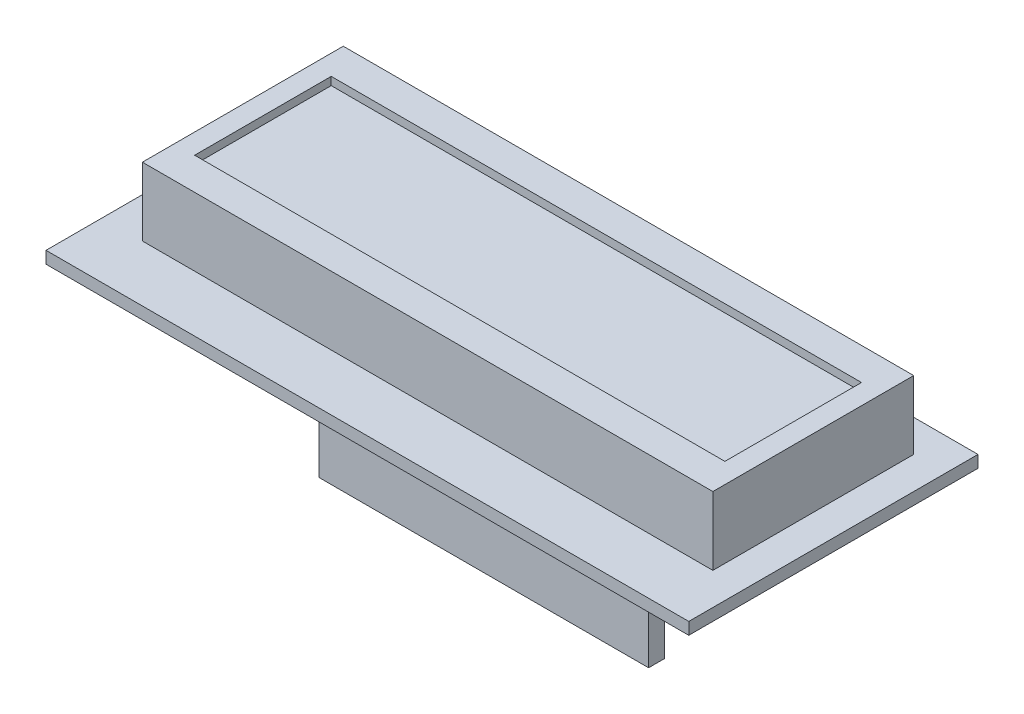
ISO-10303-21;
HEADER;
FILE_DESCRIPTION(('STEP AP214'),'2;1');
FILE_NAME('part.step','',(''),(''),'','','');
FILE_SCHEMA(('AUTOMOTIVE_DESIGN { 1 0 10303 214 1 1 1 1 }'));
ENDSEC;
DATA;
#1=APPLICATION_CONTEXT('core data for automotive mechanical design processes');
#2=APPLICATION_PROTOCOL_DEFINITION('international standard','automotive_design',2000,#1);
#3=PRODUCT_CONTEXT('',#1,'mechanical');
#4=PRODUCT('Part','Part','',(#3));
#5=PRODUCT_RELATED_PRODUCT_CATEGORY('part','',(#4));
#6=PRODUCT_DEFINITION_FORMATION('','',#4);
#7=PRODUCT_DEFINITION_CONTEXT('part definition',#1,'design');
#8=PRODUCT_DEFINITION('design','',#6,#7);
#9=PRODUCT_DEFINITION_SHAPE('','',#8);
#10=(LENGTH_UNIT() NAMED_UNIT(*) SI_UNIT(.MILLI.,.METRE.));
#11=(NAMED_UNIT(*) PLANE_ANGLE_UNIT() SI_UNIT($,.RADIAN.));
#12=(NAMED_UNIT(*) SI_UNIT($,.STERADIAN.) SOLID_ANGLE_UNIT());
#13=UNCERTAINTY_MEASURE_WITH_UNIT(LENGTH_MEASURE(1.E-05),#10,'distance_accuracy_value','');
#14=(GEOMETRIC_REPRESENTATION_CONTEXT(3) GLOBAL_UNCERTAINTY_ASSIGNED_CONTEXT((#13)) GLOBAL_UNIT_ASSIGNED_CONTEXT((#10,
#11,#12)) REPRESENTATION_CONTEXT('',''));
#15=CARTESIAN_POINT('',(0.,0.,0.));
#16=DIRECTION('',(0.,0.,1.));
#17=DIRECTION('',(1.,0.,0.));
#18=AXIS2_PLACEMENT_3D('',#15,#16,#17);
#19=CARTESIAN_POINT('',(0.,0.,0.));
#20=DIRECTION('',(0.,1.,0.));
#21=DIRECTION('',(0.,0.,1.));
#22=AXIS2_PLACEMENT_3D('',#19,#20,#21);
#23=PLANE('',#22);
#24=DIRECTION('',(0.,0.,1.));
#25=VECTOR('',#24,1.);
#26=CARTESIAN_POINT('',(-4.,0.,1.8));
#27=LINE('',#26,#25);
#28=CARTESIAN_POINT('',(-4.,0.,-1.8));
#29=VERTEX_POINT('',#28);
#30=CARTESIAN_POINT('',(-4.,0.,1.8));
#31=VERTEX_POINT('',#30);
#32=EDGE_CURVE('E249',#29,#31,#27,.T.);
#33=ORIENTED_EDGE('',*,*,#32,.F.);
#34=DIRECTION('',(-1.,0.,0.));
#35=VECTOR('',#34,1.);
#36=CARTESIAN_POINT('',(4.,0.,-1.8));
#37=LINE('',#36,#35);
#38=CARTESIAN_POINT('',(4.,0.,-1.8));
#39=VERTEX_POINT('',#38);
#40=EDGE_CURVE('E254',#39,#29,#37,.T.);
#41=ORIENTED_EDGE('',*,*,#40,.F.);
#42=DIRECTION('',(0.,0.,-1.));
#43=VECTOR('',#42,1.);
#44=CARTESIAN_POINT('',(4.,0.,1.8));
#45=LINE('',#44,#43);
#46=CARTESIAN_POINT('',(4.,0.,1.8));
#47=VERTEX_POINT('',#46);
#48=EDGE_CURVE('E265',#47,#39,#45,.T.);
#49=ORIENTED_EDGE('',*,*,#48,.F.);
#50=DIRECTION('',(1.,0.,0.));
#51=VECTOR('',#50,1.);
#52=CARTESIAN_POINT('',(4.,0.,1.8));
#53=LINE('',#52,#51);
#54=EDGE_CURVE('E263',#31,#47,#53,.T.);
#55=ORIENTED_EDGE('',*,*,#54,.F.);
#56=EDGE_LOOP('',(#33,#41,#49,#55));
#57=FACE_BOUND('',#56,.T.);
#58=DIRECTION('',(0.,0.,-1.));
#59=VECTOR('',#58,1.);
#60=CARTESIAN_POINT('',(-0.699999999999998,0.,1.7));
#61=LINE('',#60,#59);
#62=CARTESIAN_POINT('',(-0.699999999999998,0.,1.7));
#63=VERTEX_POINT('',#62);
#64=CARTESIAN_POINT('',(-0.699999999999998,0.,1.5));
#65=VERTEX_POINT('',#64);
#66=EDGE_CURVE('E183',#63,#65,#61,.T.);
#67=ORIENTED_EDGE('',*,*,#66,.F.);
#68=DIRECTION('',(-1.,0.,0.));
#69=VECTOR('',#68,1.);
#70=CARTESIAN_POINT('',(-0.699999999999998,0.,1.7));
#71=LINE('',#70,#69);
#72=CARTESIAN_POINT('',(3.4,0.,1.7));
#73=VERTEX_POINT('',#72);
#74=EDGE_CURVE('E191',#73,#63,#71,.T.);
#75=ORIENTED_EDGE('',*,*,#74,.F.);
#76=DIRECTION('',(0.,0.,1.));
#77=VECTOR('',#76,1.);
#78=CARTESIAN_POINT('',(3.4,0.,1.7));
#79=LINE('',#78,#77);
#80=CARTESIAN_POINT('',(3.4,0.,1.5));
#81=VERTEX_POINT('',#80);
#82=EDGE_CURVE('E201',#81,#73,#79,.T.);
#83=ORIENTED_EDGE('',*,*,#82,.F.);
#84=DIRECTION('',(1.,0.,0.));
#85=VECTOR('',#84,1.);
#86=CARTESIAN_POINT('',(-0.699999999999998,0.,1.5));
#87=LINE('',#86,#85);
#88=EDGE_CURVE('E59',#65,#81,#87,.T.);
#89=ORIENTED_EDGE('',*,*,#88,.F.);
#90=EDGE_LOOP('',(#67,#75,#83,#89));
#91=FACE_BOUND('',#90,.T.);
#92=ADVANCED_FACE('F36',(#57,#91),#23,.F.);
#93=CARTESIAN_POINT('',(-4.,0.15,1.8));
#94=DIRECTION('',(1.,0.,0.));
#95=DIRECTION('',(0.,0.,-1.));
#96=AXIS2_PLACEMENT_3D('',#93,#94,#95);
#97=PLANE('',#96);
#98=ORIENTED_EDGE('',*,*,#32,.T.);
#99=DIRECTION('',(0.,-1.,0.));
#100=VECTOR('',#99,1.);
#101=CARTESIAN_POINT('',(-4.,0.15,1.8));
#102=LINE('',#101,#100);
#103=CARTESIAN_POINT('',(-4.,0.15,1.8));
#104=VERTEX_POINT('',#103);
#105=EDGE_CURVE('E11',#104,#31,#102,.T.);
#106=ORIENTED_EDGE('',*,*,#105,.F.);
#107=DIRECTION('',(0.,0.,1.));
#108=VECTOR('',#107,1.);
#109=CARTESIAN_POINT('',(-4.,0.15,1.8));
#110=LINE('',#109,#108);
#111=CARTESIAN_POINT('',(-4.,0.15,-1.8));
#112=VERTEX_POINT('',#111);
#113=EDGE_CURVE('E250',#112,#104,#110,.T.);
#114=ORIENTED_EDGE('',*,*,#113,.F.);
#115=DIRECTION('',(0.,-1.,0.));
#116=VECTOR('',#115,1.);
#117=CARTESIAN_POINT('',(-4.,0.15,-1.8));
#118=LINE('',#117,#116);
#119=EDGE_CURVE('E260',#112,#29,#118,.T.);
#120=ORIENTED_EDGE('',*,*,#119,.T.);
#121=EDGE_LOOP('',(#98,#106,#114,#120));
#122=FACE_BOUND('',#121,.T.);
#123=ADVANCED_FACE('F38',(#122),#97,.F.);
#124=CARTESIAN_POINT('',(4.,0.15,1.8));
#125=DIRECTION('',(0.,0.,-1.));
#126=DIRECTION('',(-1.,0.,0.));
#127=AXIS2_PLACEMENT_3D('',#124,#125,#126);
#128=PLANE('',#127);
#129=ORIENTED_EDGE('',*,*,#54,.T.);
#130=DIRECTION('',(0.,-1.,0.));
#131=VECTOR('',#130,1.);
#132=CARTESIAN_POINT('',(4.,0.15,1.8));
#133=LINE('',#132,#131);
#134=CARTESIAN_POINT('',(4.,0.15,1.8));
#135=VERTEX_POINT('',#134);
#136=EDGE_CURVE('E44',#135,#47,#133,.T.);
#137=ORIENTED_EDGE('',*,*,#136,.F.);
#138=DIRECTION('',(1.,0.,0.));
#139=VECTOR('',#138,1.);
#140=CARTESIAN_POINT('',(4.,0.15,1.8));
#141=LINE('',#140,#139);
#142=EDGE_CURVE('E253',#104,#135,#141,.T.);
#143=ORIENTED_EDGE('',*,*,#142,.F.);
#144=ORIENTED_EDGE('',*,*,#105,.T.);
#145=EDGE_LOOP('',(#129,#137,#143,#144));
#146=FACE_BOUND('',#145,.T.);
#147=ADVANCED_FACE('F292',(#146),#128,.F.);
#148=CARTESIAN_POINT('',(4.,0.15,1.8));
#149=DIRECTION('',(-1.,0.,0.));
#150=DIRECTION('',(0.,0.,1.));
#151=AXIS2_PLACEMENT_3D('',#148,#149,#150);
#152=PLANE('',#151);
#153=ORIENTED_EDGE('',*,*,#48,.T.);
#154=DIRECTION('',(0.,-1.,0.));
#155=VECTOR('',#154,1.);
#156=CARTESIAN_POINT('',(4.,0.15,-1.8));
#157=LINE('',#156,#155);
#158=CARTESIAN_POINT('',(4.,0.15,-1.8));
#159=VERTEX_POINT('',#158);
#160=EDGE_CURVE('E270',#159,#39,#157,.T.);
#161=ORIENTED_EDGE('',*,*,#160,.F.);
#162=DIRECTION('',(0.,0.,-1.));
#163=VECTOR('',#162,1.);
#164=CARTESIAN_POINT('',(4.,0.15,1.8));
#165=LINE('',#164,#163);
#166=EDGE_CURVE('E256',#135,#159,#165,.T.);
#167=ORIENTED_EDGE('',*,*,#166,.F.);
#168=ORIENTED_EDGE('',*,*,#136,.T.);
#169=EDGE_LOOP('',(#153,#161,#167,#168));
#170=FACE_BOUND('',#169,.T.);
#171=ADVANCED_FACE('F277',(#170),#152,.F.);
#172=CARTESIAN_POINT('',(4.,0.15,-1.8));
#173=DIRECTION('',(0.,0.,1.));
#174=DIRECTION('',(1.,0.,0.));
#175=AXIS2_PLACEMENT_3D('',#172,#173,#174);
#176=PLANE('',#175);
#177=ORIENTED_EDGE('',*,*,#40,.T.);
#178=ORIENTED_EDGE('',*,*,#119,.F.);
#179=DIRECTION('',(-1.,0.,0.));
#180=VECTOR('',#179,1.);
#181=CARTESIAN_POINT('',(4.,0.15,-1.8));
#182=LINE('',#181,#180);
#183=EDGE_CURVE('E258',#159,#112,#182,.T.);
#184=ORIENTED_EDGE('',*,*,#183,.F.);
#185=ORIENTED_EDGE('',*,*,#160,.T.);
#186=EDGE_LOOP('',(#177,#178,#184,#185));
#187=FACE_BOUND('',#186,.T.);
#188=ADVANCED_FACE('F285',(#187),#176,.F.);
#189=CARTESIAN_POINT('',(0.,0.15,0.));
#190=DIRECTION('',(0.,1.,0.));
#191=DIRECTION('',(0.,0.,1.));
#192=AXIS2_PLACEMENT_3D('',#189,#190,#191);
#193=PLANE('',#192);
#194=DIRECTION('',(0.,0.,1.));
#195=VECTOR('',#194,1.);
#196=CARTESIAN_POINT('',(-3.5,0.15,-1.4));
#197=LINE('',#196,#195);
#198=CARTESIAN_POINT('',(-3.5,0.15,-1.4));
#199=VERTEX_POINT('',#198);
#200=CARTESIAN_POINT('',(-3.5,0.15,1.1));
#201=VERTEX_POINT('',#200);
#202=EDGE_CURVE('E216',#199,#201,#197,.T.);
#203=ORIENTED_EDGE('',*,*,#202,.F.);
#204=DIRECTION('',(1.,0.,0.));
#205=VECTOR('',#204,1.);
#206=CARTESIAN_POINT('',(-3.5,0.15,-1.4));
#207=LINE('',#206,#205);
#208=CARTESIAN_POINT('',(3.6,0.15,-1.4));
#209=VERTEX_POINT('',#208);
#210=EDGE_CURVE('E221',#199,#209,#207,.T.);
#211=ORIENTED_EDGE('',*,*,#210,.T.);
#212=DIRECTION('',(0.,0.,1.));
#213=VECTOR('',#212,1.);
#214=CARTESIAN_POINT('',(3.6,0.15,-1.4));
#215=LINE('',#214,#213);
#216=CARTESIAN_POINT('',(3.6,0.15,1.1));
#217=VERTEX_POINT('',#216);
#218=EDGE_CURVE('E235',#209,#217,#215,.T.);
#219=ORIENTED_EDGE('',*,*,#218,.T.);
#220=DIRECTION('',(1.,0.,0.));
#221=VECTOR('',#220,1.);
#222=CARTESIAN_POINT('',(-3.5,0.15,1.1));
#223=LINE('',#222,#221);
#224=EDGE_CURVE('E232',#201,#217,#223,.T.);
#225=ORIENTED_EDGE('',*,*,#224,.F.);
#226=EDGE_LOOP('',(#203,#211,#219,#225));
#227=FACE_BOUND('',#226,.T.);
#228=ORIENTED_EDGE('',*,*,#113,.T.);
#229=ORIENTED_EDGE('',*,*,#142,.T.);
#230=ORIENTED_EDGE('',*,*,#166,.T.);
#231=ORIENTED_EDGE('',*,*,#183,.T.);
#232=EDGE_LOOP('',(#228,#229,#230,#231));
#233=FACE_BOUND('',#232,.T.);
#234=ADVANCED_FACE('F291',(#227,#233),#193,.T.);
#235=CARTESIAN_POINT('',(-3.5,1.,-1.4));
#236=DIRECTION('',(1.,0.,0.));
#237=DIRECTION('',(0.,0.,-1.));
#238=AXIS2_PLACEMENT_3D('',#235,#236,#237);
#239=PLANE('',#238);
#240=ORIENTED_EDGE('',*,*,#202,.T.);
#241=DIRECTION('',(0.,-1.,0.));
#242=VECTOR('',#241,1.);
#243=CARTESIAN_POINT('',(-3.5,1.,1.1));
#244=LINE('',#243,#242);
#245=CARTESIAN_POINT('',(-3.5,1.,1.1));
#246=VERTEX_POINT('',#245);
#247=EDGE_CURVE('E246',#246,#201,#244,.T.);
#248=ORIENTED_EDGE('',*,*,#247,.F.);
#249=DIRECTION('',(0.,0.,1.));
#250=VECTOR('',#249,1.);
#251=CARTESIAN_POINT('',(-3.5,1.,-1.4));
#252=LINE('',#251,#250);
#253=CARTESIAN_POINT('',(-3.5,1.,-1.4));
#254=VERTEX_POINT('',#253);
#255=EDGE_CURVE('E217',#254,#246,#252,.T.);
#256=ORIENTED_EDGE('',*,*,#255,.F.);
#257=DIRECTION('',(0.,-1.,0.));
#258=VECTOR('',#257,1.);
#259=CARTESIAN_POINT('',(-3.5,1.,-1.4));
#260=LINE('',#259,#258);
#261=EDGE_CURVE('E229',#254,#199,#260,.T.);
#262=ORIENTED_EDGE('',*,*,#261,.T.);
#263=EDGE_LOOP('',(#240,#248,#256,#262));
#264=FACE_BOUND('',#263,.T.);
#265=ADVANCED_FACE('F310',(#264),#239,.F.);
#266=CARTESIAN_POINT('',(-3.5,1.,1.1));
#267=DIRECTION('',(0.,0.,-1.));
#268=DIRECTION('',(-1.,0.,0.));
#269=AXIS2_PLACEMENT_3D('',#266,#267,#268);
#270=PLANE('',#269);
#271=ORIENTED_EDGE('',*,*,#224,.T.);
#272=DIRECTION('',(0.,-1.,0.));
#273=VECTOR('',#272,1.);
#274=CARTESIAN_POINT('',(3.6,1.,1.1));
#275=LINE('',#274,#273);
#276=CARTESIAN_POINT('',(3.6,1.,1.1));
#277=VERTEX_POINT('',#276);
#278=EDGE_CURVE('E243',#277,#217,#275,.T.);
#279=ORIENTED_EDGE('',*,*,#278,.F.);
#280=DIRECTION('',(1.,0.,0.));
#281=VECTOR('',#280,1.);
#282=CARTESIAN_POINT('',(-3.5,1.,1.1));
#283=LINE('',#282,#281);
#284=EDGE_CURVE('E220',#246,#277,#283,.T.);
#285=ORIENTED_EDGE('',*,*,#284,.F.);
#286=ORIENTED_EDGE('',*,*,#247,.T.);
#287=EDGE_LOOP('',(#271,#279,#285,#286));
#288=FACE_BOUND('',#287,.T.);
#289=ADVANCED_FACE('F315',(#288),#270,.F.);
#290=CARTESIAN_POINT('',(3.6,1.,-1.4));
#291=DIRECTION('',(1.,0.,0.));
#292=DIRECTION('',(0.,0.,-1.));
#293=AXIS2_PLACEMENT_3D('',#290,#291,#292);
#294=PLANE('',#293);
#295=ORIENTED_EDGE('',*,*,#218,.F.);
#296=DIRECTION('',(0.,-1.,0.));
#297=VECTOR('',#296,1.);
#298=CARTESIAN_POINT('',(3.6,1.,-1.4));
#299=LINE('',#298,#297);
#300=CARTESIAN_POINT('',(3.6,1.,-1.4));
#301=VERTEX_POINT('',#300);
#302=EDGE_CURVE('E240',#301,#209,#299,.T.);
#303=ORIENTED_EDGE('',*,*,#302,.F.);
#304=DIRECTION('',(0.,0.,1.));
#305=VECTOR('',#304,1.);
#306=CARTESIAN_POINT('',(3.6,1.,-1.4));
#307=LINE('',#306,#305);
#308=EDGE_CURVE('E223',#301,#277,#307,.T.);
#309=ORIENTED_EDGE('',*,*,#308,.T.);
#310=ORIENTED_EDGE('',*,*,#278,.T.);
#311=EDGE_LOOP('',(#295,#303,#309,#310));
#312=FACE_BOUND('',#311,.T.);
#313=ADVANCED_FACE('F326',(#312),#294,.T.);
#314=CARTESIAN_POINT('',(-3.5,1.,-1.4));
#315=DIRECTION('',(0.,0.,-1.));
#316=DIRECTION('',(-1.,0.,0.));
#317=AXIS2_PLACEMENT_3D('',#314,#315,#316);
#318=PLANE('',#317);
#319=ORIENTED_EDGE('',*,*,#210,.F.);
#320=ORIENTED_EDGE('',*,*,#261,.F.);
#321=DIRECTION('',(1.,0.,0.));
#322=VECTOR('',#321,1.);
#323=CARTESIAN_POINT('',(-3.5,1.,-1.4));
#324=LINE('',#323,#322);
#325=EDGE_CURVE('E226',#254,#301,#324,.T.);
#326=ORIENTED_EDGE('',*,*,#325,.T.);
#327=ORIENTED_EDGE('',*,*,#302,.T.);
#328=EDGE_LOOP('',(#319,#320,#326,#327));
#329=FACE_BOUND('',#328,.T.);
#330=ADVANCED_FACE('F322',(#329),#318,.T.);
#331=CARTESIAN_POINT('',(0.,1.,0.));
#332=DIRECTION('',(0.,1.,0.));
#333=DIRECTION('',(0.,0.,1.));
#334=AXIS2_PLACEMENT_3D('',#331,#332,#333);
#335=PLANE('',#334);
#336=DIRECTION('',(0.,0.,1.));
#337=VECTOR('',#336,1.);
#338=CARTESIAN_POINT('',(-3.25,1.,-0.999999999999999));
#339=LINE('',#338,#337);
#340=CARTESIAN_POINT('',(-3.25,1.,-0.999999999999999));
#341=VERTEX_POINT('',#340);
#342=CARTESIAN_POINT('',(-3.25,1.,0.700000000000001));
#343=VERTEX_POINT('',#342);
#344=EDGE_CURVE('E51',#341,#343,#339,.T.);
#345=ORIENTED_EDGE('',*,*,#344,.F.);
#346=DIRECTION('',(1.,0.,0.));
#347=VECTOR('',#346,1.);
#348=CARTESIAN_POINT('',(-3.25,1.,-0.999999999999999));
#349=LINE('',#348,#347);
#350=CARTESIAN_POINT('',(3.35,1.,-1.));
#351=VERTEX_POINT('',#350);
#352=EDGE_CURVE('E168',#341,#351,#349,.T.);
#353=ORIENTED_EDGE('',*,*,#352,.T.);
#354=DIRECTION('',(0.,0.,1.));
#355=VECTOR('',#354,1.);
#356=CARTESIAN_POINT('',(3.35,1.,-1.));
#357=LINE('',#356,#355);
#358=CARTESIAN_POINT('',(3.35,1.,0.699999999999999));
#359=VERTEX_POINT('',#358);
#360=EDGE_CURVE('E171',#351,#359,#357,.T.);
#361=ORIENTED_EDGE('',*,*,#360,.T.);
#362=DIRECTION('',(1.,0.,0.));
#363=VECTOR('',#362,1.);
#364=CARTESIAN_POINT('',(-3.25,1.,0.700000000000001));
#365=LINE('',#364,#363);
#366=EDGE_CURVE('E177',#343,#359,#365,.T.);
#367=ORIENTED_EDGE('',*,*,#366,.F.);
#368=EDGE_LOOP('',(#345,#353,#361,#367));
#369=FACE_BOUND('',#368,.T.);
#370=ORIENTED_EDGE('',*,*,#255,.T.);
#371=ORIENTED_EDGE('',*,*,#284,.T.);
#372=ORIENTED_EDGE('',*,*,#308,.F.);
#373=ORIENTED_EDGE('',*,*,#325,.F.);
#374=EDGE_LOOP('',(#370,#371,#372,#373));
#375=FACE_BOUND('',#374,.T.);
#376=ADVANCED_FACE('F330',(#369,#375),#335,.T.);
#377=CARTESIAN_POINT('',(-0.699999999999998,-0.7,1.7));
#378=DIRECTION('',(1.,0.,0.));
#379=DIRECTION('',(0.,0.,-1.));
#380=AXIS2_PLACEMENT_3D('',#377,#378,#379);
#381=PLANE('',#380);
#382=ORIENTED_EDGE('',*,*,#66,.T.);
#383=DIRECTION('',(0.,1.,0.));
#384=VECTOR('',#383,1.);
#385=CARTESIAN_POINT('',(-0.699999999999998,-0.7,1.5));
#386=LINE('',#385,#384);
#387=CARTESIAN_POINT('',(-0.699999999999998,-0.7,1.5));
#388=VERTEX_POINT('',#387);
#389=EDGE_CURVE('E214',#388,#65,#386,.T.);
#390=ORIENTED_EDGE('',*,*,#389,.F.);
#391=DIRECTION('',(0.,0.,-1.));
#392=VECTOR('',#391,1.);
#393=CARTESIAN_POINT('',(-0.699999999999998,-0.7,1.7));
#394=LINE('',#393,#392);
#395=CARTESIAN_POINT('',(-0.699999999999998,-0.7,1.7));
#396=VERTEX_POINT('',#395);
#397=EDGE_CURVE('E187',#396,#388,#394,.T.);
#398=ORIENTED_EDGE('',*,*,#397,.F.);
#399=DIRECTION('',(0.,1.,0.));
#400=VECTOR('',#399,1.);
#401=CARTESIAN_POINT('',(-0.699999999999998,-0.7,1.7));
#402=LINE('',#401,#400);
#403=EDGE_CURVE('E197',#396,#63,#402,.T.);
#404=ORIENTED_EDGE('',*,*,#403,.T.);
#405=EDGE_LOOP('',(#382,#390,#398,#404));
#406=FACE_BOUND('',#405,.T.);
#407=ADVANCED_FACE('F332',(#406),#381,.F.);
#408=CARTESIAN_POINT('',(-0.699999999999998,-0.7,1.5));
#409=DIRECTION('',(0.,0.,1.));
#410=DIRECTION('',(1.,0.,0.));
#411=AXIS2_PLACEMENT_3D('',#408,#409,#410);
#412=PLANE('',#411);
#413=ORIENTED_EDGE('',*,*,#88,.T.);
#414=DIRECTION('',(0.,1.,0.));
#415=VECTOR('',#414,1.);
#416=CARTESIAN_POINT('',(3.4,-0.7,1.5));
#417=LINE('',#416,#415);
#418=CARTESIAN_POINT('',(3.4,-0.7,1.5));
#419=VERTEX_POINT('',#418);
#420=EDGE_CURVE('E211',#419,#81,#417,.T.);
#421=ORIENTED_EDGE('',*,*,#420,.F.);
#422=DIRECTION('',(1.,0.,0.));
#423=VECTOR('',#422,1.);
#424=CARTESIAN_POINT('',(-0.699999999999998,-0.7,1.5));
#425=LINE('',#424,#423);
#426=EDGE_CURVE('E190',#388,#419,#425,.T.);
#427=ORIENTED_EDGE('',*,*,#426,.F.);
#428=ORIENTED_EDGE('',*,*,#389,.T.);
#429=EDGE_LOOP('',(#413,#421,#427,#428));
#430=FACE_BOUND('',#429,.T.);
#431=ADVANCED_FACE('F339',(#430),#412,.F.);
#432=CARTESIAN_POINT('',(3.4,-0.7,1.7));
#433=DIRECTION('',(-1.,0.,0.));
#434=DIRECTION('',(0.,0.,1.));
#435=AXIS2_PLACEMENT_3D('',#432,#433,#434);
#436=PLANE('',#435);
#437=ORIENTED_EDGE('',*,*,#82,.T.);
#438=DIRECTION('',(0.,1.,0.));
#439=VECTOR('',#438,1.);
#440=CARTESIAN_POINT('',(3.4,-0.7,1.7));
#441=LINE('',#440,#439);
#442=CARTESIAN_POINT('',(3.4,-0.7,1.7));
#443=VERTEX_POINT('',#442);
#444=EDGE_CURVE('E208',#443,#73,#441,.T.);
#445=ORIENTED_EDGE('',*,*,#444,.F.);
#446=DIRECTION('',(0.,0.,1.));
#447=VECTOR('',#446,1.);
#448=CARTESIAN_POINT('',(3.4,-0.7,1.7));
#449=LINE('',#448,#447);
#450=EDGE_CURVE('E193',#419,#443,#449,.T.);
#451=ORIENTED_EDGE('',*,*,#450,.F.);
#452=ORIENTED_EDGE('',*,*,#420,.T.);
#453=EDGE_LOOP('',(#437,#445,#451,#452));
#454=FACE_BOUND('',#453,.T.);
#455=ADVANCED_FACE('F409',(#454),#436,.F.);
#456=CARTESIAN_POINT('',(-0.699999999999998,-0.7,1.7));
#457=DIRECTION('',(0.,0.,-1.));
#458=DIRECTION('',(-1.,0.,0.));
#459=AXIS2_PLACEMENT_3D('',#456,#457,#458);
#460=PLANE('',#459);
#461=ORIENTED_EDGE('',*,*,#74,.T.);
#462=ORIENTED_EDGE('',*,*,#403,.F.);
#463=DIRECTION('',(-1.,0.,0.));
#464=VECTOR('',#463,1.);
#465=CARTESIAN_POINT('',(-0.699999999999998,-0.7,1.7));
#466=LINE('',#465,#464);
#467=EDGE_CURVE('E195',#443,#396,#466,.T.);
#468=ORIENTED_EDGE('',*,*,#467,.F.);
#469=ORIENTED_EDGE('',*,*,#444,.T.);
#470=EDGE_LOOP('',(#461,#462,#468,#469));
#471=FACE_BOUND('',#470,.T.);
#472=ADVANCED_FACE('F418',(#471),#460,.F.);
#473=CARTESIAN_POINT('',(0.,-0.7,0.));
#474=DIRECTION('',(0.,-1.,0.));
#475=DIRECTION('',(0.,0.,-1.));
#476=AXIS2_PLACEMENT_3D('',#473,#474,#475);
#477=PLANE('',#476);
#478=ORIENTED_EDGE('',*,*,#397,.T.);
#479=ORIENTED_EDGE('',*,*,#426,.T.);
#480=ORIENTED_EDGE('',*,*,#450,.T.);
#481=ORIENTED_EDGE('',*,*,#467,.T.);
#482=EDGE_LOOP('',(#478,#479,#480,#481));
#483=FACE_BOUND('',#482,.T.);
#484=ADVANCED_FACE('F428',(#483),#477,.T.);
#485=CARTESIAN_POINT('',(-3.25,0.9,-0.999999999999999));
#486=DIRECTION('',(-1.,0.,0.));
#487=DIRECTION('',(0.,0.,1.));
#488=AXIS2_PLACEMENT_3D('',#485,#486,#487);
#489=PLANE('',#488);
#490=ORIENTED_EDGE('',*,*,#344,.T.);
#491=DIRECTION('',(0.,1.,0.));
#492=VECTOR('',#491,1.);
#493=CARTESIAN_POINT('',(-3.25,0.9,0.700000000000001));
#494=LINE('',#493,#492);
#495=CARTESIAN_POINT('',(-3.25,0.9,0.700000000000001));
#496=VERTEX_POINT('',#495);
#497=EDGE_CURVE('E147',#496,#343,#494,.T.);
#498=ORIENTED_EDGE('',*,*,#497,.F.);
#499=DIRECTION('',(0.,0.,1.));
#500=VECTOR('',#499,1.);
#501=CARTESIAN_POINT('',(-3.25,0.9,-0.999999999999999));
#502=LINE('',#501,#500);
#503=CARTESIAN_POINT('',(-3.25,0.9,-0.999999999999999));
#504=VERTEX_POINT('',#503);
#505=EDGE_CURVE('E151',#504,#496,#502,.T.);
#506=ORIENTED_EDGE('',*,*,#505,.F.);
#507=DIRECTION('',(0.,1.,0.));
#508=VECTOR('',#507,1.);
#509=CARTESIAN_POINT('',(-3.25,0.9,-0.999999999999999));
#510=LINE('',#509,#508);
#511=EDGE_CURVE('E181',#504,#341,#510,.T.);
#512=ORIENTED_EDGE('',*,*,#511,.T.);
#513=EDGE_LOOP('',(#490,#498,#506,#512));
#514=FACE_BOUND('',#513,.T.);
#515=ADVANCED_FACE('F149',(#514),#489,.F.);
#516=CARTESIAN_POINT('',(-3.25,0.9,-0.999999999999999));
#517=DIRECTION('',(0.,0.,1.));
#518=DIRECTION('',(1.,0.,0.));
#519=AXIS2_PLACEMENT_3D('',#516,#517,#518);
#520=PLANE('',#519);
#521=ORIENTED_EDGE('',*,*,#352,.F.);
#522=ORIENTED_EDGE('',*,*,#511,.F.);
#523=DIRECTION('',(1.,0.,0.));
#524=VECTOR('',#523,1.);
#525=CARTESIAN_POINT('',(-3.25,0.9,-0.999999999999999));
#526=LINE('',#525,#524);
#527=CARTESIAN_POINT('',(3.35,0.9,-1.));
#528=VERTEX_POINT('',#527);
#529=EDGE_CURVE('E156',#504,#528,#526,.T.);
#530=ORIENTED_EDGE('',*,*,#529,.T.);
#531=DIRECTION('',(0.,1.,0.));
#532=VECTOR('',#531,1.);
#533=CARTESIAN_POINT('',(3.35,0.9,-1.));
#534=LINE('',#533,#532);
#535=EDGE_CURVE('E184',#528,#351,#534,.T.);
#536=ORIENTED_EDGE('',*,*,#535,.T.);
#537=EDGE_LOOP('',(#521,#522,#530,#536));
#538=FACE_BOUND('',#537,.T.);
#539=ADVANCED_FACE('F445',(#538),#520,.T.);
#540=CARTESIAN_POINT('',(3.35,0.9,-1.));
#541=DIRECTION('',(-1.,0.,0.));
#542=DIRECTION('',(0.,0.,1.));
#543=AXIS2_PLACEMENT_3D('',#540,#541,#542);
#544=PLANE('',#543);
#545=ORIENTED_EDGE('',*,*,#360,.F.);
#546=ORIENTED_EDGE('',*,*,#535,.F.);
#547=DIRECTION('',(0.,0.,1.));
#548=VECTOR('',#547,1.);
#549=CARTESIAN_POINT('',(3.35,0.9,-1.));
#550=LINE('',#549,#548);
#551=CARTESIAN_POINT('',(3.35,0.9,0.699999999999999));
#552=VERTEX_POINT('',#551);
#553=EDGE_CURVE('E164',#528,#552,#550,.T.);
#554=ORIENTED_EDGE('',*,*,#553,.T.);
#555=DIRECTION('',(0.,1.,0.));
#556=VECTOR('',#555,1.);
#557=CARTESIAN_POINT('',(3.35,0.9,0.699999999999999));
#558=LINE('',#557,#556);
#559=EDGE_CURVE('E155',#552,#359,#558,.T.);
#560=ORIENTED_EDGE('',*,*,#559,.T.);
#561=EDGE_LOOP('',(#545,#546,#554,#560));
#562=FACE_BOUND('',#561,.T.);
#563=ADVANCED_FACE('F454',(#562),#544,.T.);
#564=CARTESIAN_POINT('',(-3.25,0.9,0.700000000000001));
#565=DIRECTION('',(0.,0.,1.));
#566=DIRECTION('',(1.,0.,0.));
#567=AXIS2_PLACEMENT_3D('',#564,#565,#566);
#568=PLANE('',#567);
#569=ORIENTED_EDGE('',*,*,#366,.T.);
#570=ORIENTED_EDGE('',*,*,#559,.F.);
#571=DIRECTION('',(1.,0.,0.));
#572=VECTOR('',#571,1.);
#573=CARTESIAN_POINT('',(-3.25,0.9,0.700000000000001));
#574=LINE('',#573,#572);
#575=EDGE_CURVE('E160',#496,#552,#574,.T.);
#576=ORIENTED_EDGE('',*,*,#575,.F.);
#577=ORIENTED_EDGE('',*,*,#497,.T.);
#578=EDGE_LOOP('',(#569,#570,#576,#577));
#579=FACE_BOUND('',#578,.T.);
#580=ADVANCED_FACE('F161',(#579),#568,.F.);
#581=CARTESIAN_POINT('',(0.,0.9,0.));
#582=DIRECTION('',(0.,1.,0.));
#583=DIRECTION('',(0.,0.,1.));
#584=AXIS2_PLACEMENT_3D('',#581,#582,#583);
#585=PLANE('',#584);
#586=ORIENTED_EDGE('',*,*,#505,.T.);
#587=ORIENTED_EDGE('',*,*,#575,.T.);
#588=ORIENTED_EDGE('',*,*,#553,.F.);
#589=ORIENTED_EDGE('',*,*,#529,.F.);
#590=EDGE_LOOP('',(#586,#587,#588,#589));
#591=FACE_BOUND('',#590,.T.);
#592=ADVANCED_FACE('F167',(#591),#585,.T.);
#593=CLOSED_SHELL('',(#92,#123,#147,#171,#188,#234,#265,#289,#313,#330,#376,#407,#431,#455,#472,
#484,#515,#539,#563,#580,#592));
#594=MANIFOLD_SOLID_BREP('B2',#593);
#595=ADVANCED_BREP_SHAPE_REPRESENTATION('',(#18,#594),#14);
#596=SHAPE_DEFINITION_REPRESENTATION(#9,#595);
ENDSEC;
END-ISO-10303-21;
